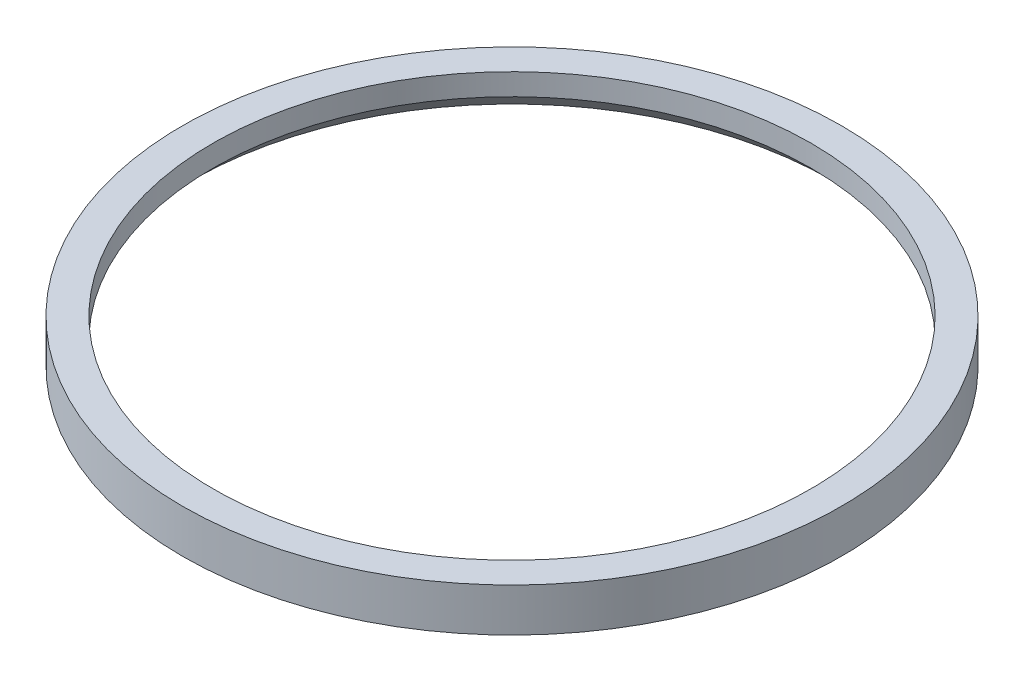
ISO-10303-21;
HEADER;
FILE_DESCRIPTION(('STEP AP214'),'2;1');
FILE_NAME('part.step','',(''),(''),'','','');
FILE_SCHEMA(('AUTOMOTIVE_DESIGN { 1 0 10303 214 1 1 1 1 }'));
ENDSEC;
DATA;
#1=APPLICATION_CONTEXT('core data for automotive mechanical design processes');
#2=APPLICATION_PROTOCOL_DEFINITION('international standard','automotive_design',2000,#1);
#3=PRODUCT_CONTEXT('',#1,'mechanical');
#4=PRODUCT('Part','Part','',(#3));
#5=PRODUCT_RELATED_PRODUCT_CATEGORY('part','',(#4));
#6=PRODUCT_DEFINITION_FORMATION('','',#4);
#7=PRODUCT_DEFINITION_CONTEXT('part definition',#1,'design');
#8=PRODUCT_DEFINITION('design','',#6,#7);
#9=PRODUCT_DEFINITION_SHAPE('','',#8);
#10=(LENGTH_UNIT() NAMED_UNIT(*) SI_UNIT(.MILLI.,.METRE.));
#11=(NAMED_UNIT(*) PLANE_ANGLE_UNIT() SI_UNIT($,.RADIAN.));
#12=(NAMED_UNIT(*) SI_UNIT($,.STERADIAN.) SOLID_ANGLE_UNIT());
#13=UNCERTAINTY_MEASURE_WITH_UNIT(LENGTH_MEASURE(1.E-05),#10,'distance_accuracy_value','');
#14=(GEOMETRIC_REPRESENTATION_CONTEXT(3) GLOBAL_UNCERTAINTY_ASSIGNED_CONTEXT((#13)) GLOBAL_UNIT_ASSIGNED_CONTEXT((#10,
#11,#12)) REPRESENTATION_CONTEXT('',''));
#15=CARTESIAN_POINT('',(0.,0.,0.));
#16=DIRECTION('',(0.,0.,1.));
#17=DIRECTION('',(1.,0.,0.));
#18=AXIS2_PLACEMENT_3D('',#15,#16,#17);
#19=CARTESIAN_POINT('',(0.,1.25,0.));
#20=DIRECTION('',(0.,-1.,0.));
#21=DIRECTION('',(0.,0.,-1.));
#22=AXIS2_PLACEMENT_3D('',#19,#20,#21);
#23=CONICAL_SURFACE('',#22,17.25,0.785398163397453);
#24=CARTESIAN_POINT('',(0.,0.,0.));
#25=DIRECTION('',(0.,-1.,0.));
#26=DIRECTION('',(0.,0.,-1.));
#27=AXIS2_PLACEMENT_3D('',#24,#25,#26);
#28=CIRCLE('',#27,18.5);
#29=CARTESIAN_POINT('',(0.,0.,-18.5));
#30=VERTEX_POINT('',#29);
#31=EDGE_CURVE('E60',#30,#30,#28,.T.);
#32=ORIENTED_EDGE('',*,*,#31,.T.);
#33=EDGE_LOOP('',(#32));
#34=FACE_BOUND('',#33,.T.);
#35=CARTESIAN_POINT('',(0.,1.25,0.));
#36=DIRECTION('',(0.,-1.,0.));
#37=DIRECTION('',(0.,0.,-1.));
#38=AXIS2_PLACEMENT_3D('',#35,#36,#37);
#39=CIRCLE('',#38,17.25);
#40=CARTESIAN_POINT('',(0.,1.25,-17.25));
#41=VERTEX_POINT('',#40);
#42=EDGE_CURVE('E10',#41,#41,#39,.T.);
#43=ORIENTED_EDGE('',*,*,#42,.F.);
#44=EDGE_LOOP('',(#43));
#45=FACE_BOUND('',#44,.T.);
#46=ADVANCED_FACE('F37',(#34,#45),#23,.F.);
#47=CARTESIAN_POINT('',(0.,0.,0.));
#48=DIRECTION('',(0.,-1.,0.));
#49=DIRECTION('',(0.,0.,-1.));
#50=AXIS2_PLACEMENT_3D('',#47,#48,#49);
#51=CYLINDRICAL_SURFACE('',#50,17.25);
#52=ORIENTED_EDGE('',*,*,#42,.T.);
#53=EDGE_LOOP('',(#52));
#54=FACE_BOUND('',#53,.T.);
#55=CARTESIAN_POINT('',(0.,2.5,0.));
#56=DIRECTION('',(0.,-1.,0.));
#57=DIRECTION('',(0.,0.,-1.));
#58=AXIS2_PLACEMENT_3D('',#55,#56,#57);
#59=CIRCLE('',#58,17.25);
#60=CARTESIAN_POINT('',(0.,2.5,-17.25));
#61=VERTEX_POINT('',#60);
#62=EDGE_CURVE('E44',#61,#61,#59,.T.);
#63=ORIENTED_EDGE('',*,*,#62,.F.);
#64=EDGE_LOOP('',(#63));
#65=FACE_BOUND('',#64,.T.);
#66=ADVANCED_FACE('F79',(#54,#65),#51,.F.);
#67=CARTESIAN_POINT('',(0.,2.5,-17.25));
#68=DIRECTION('',(0.,1.,0.));
#69=DIRECTION('',(0.,0.,1.));
#70=AXIS2_PLACEMENT_3D('',#67,#68,#69);
#71=PLANE('',#70);
#72=ORIENTED_EDGE('',*,*,#62,.T.);
#73=EDGE_LOOP('',(#72));
#74=FACE_BOUND('',#73,.T.);
#75=CARTESIAN_POINT('',(0.,2.5,0.));
#76=DIRECTION('',(0.,-1.,0.));
#77=DIRECTION('',(0.,0.,-1.));
#78=AXIS2_PLACEMENT_3D('',#75,#76,#77);
#79=CIRCLE('',#78,19.);
#80=CARTESIAN_POINT('',(0.,2.5,-19.));
#81=VERTEX_POINT('',#80);
#82=EDGE_CURVE('E49',#81,#81,#79,.T.);
#83=ORIENTED_EDGE('',*,*,#82,.F.);
#84=EDGE_LOOP('',(#83));
#85=FACE_BOUND('',#84,.T.);
#86=ADVANCED_FACE('F75',(#74,#85),#71,.T.);
#87=CARTESIAN_POINT('',(0.,0.,0.));
#88=DIRECTION('',(0.,-1.,0.));
#89=DIRECTION('',(0.,0.,-1.));
#90=AXIS2_PLACEMENT_3D('',#87,#88,#89);
#91=CYLINDRICAL_SURFACE('',#90,19.);
#92=ORIENTED_EDGE('',*,*,#82,.T.);
#93=EDGE_LOOP('',(#92));
#94=FACE_BOUND('',#93,.T.);
#95=CARTESIAN_POINT('',(0.,0.,0.));
#96=DIRECTION('',(0.,-1.,0.));
#97=DIRECTION('',(0.,0.,-1.));
#98=AXIS2_PLACEMENT_3D('',#95,#96,#97);
#99=CIRCLE('',#98,19.);
#100=CARTESIAN_POINT('',(0.,0.,-19.));
#101=VERTEX_POINT('',#100);
#102=EDGE_CURVE('E54',#101,#101,#99,.T.);
#103=ORIENTED_EDGE('',*,*,#102,.F.);
#104=EDGE_LOOP('',(#103));
#105=FACE_BOUND('',#104,.T.);
#106=ADVANCED_FACE('F69',(#94,#105),#91,.T.);
#107=CARTESIAN_POINT('',(0.,0.,-18.5));
#108=DIRECTION('',(0.,-1.,0.));
#109=DIRECTION('',(0.,0.,-1.));
#110=AXIS2_PLACEMENT_3D('',#107,#108,#109);
#111=PLANE('',#110);
#112=ORIENTED_EDGE('',*,*,#102,.T.);
#113=EDGE_LOOP('',(#112));
#114=FACE_BOUND('',#113,.T.);
#115=ORIENTED_EDGE('',*,*,#31,.F.);
#116=EDGE_LOOP('',(#115));
#117=FACE_BOUND('',#116,.T.);
#118=ADVANCED_FACE('F67',(#114,#117),#111,.T.);
#119=CLOSED_SHELL('',(#46,#66,#86,#106,#118));
#120=MANIFOLD_SOLID_BREP('B2',#119);
#121=ADVANCED_BREP_SHAPE_REPRESENTATION('',(#18,#120),#14);
#122=SHAPE_DEFINITION_REPRESENTATION(#9,#121);
ENDSEC;
END-ISO-10303-21;
